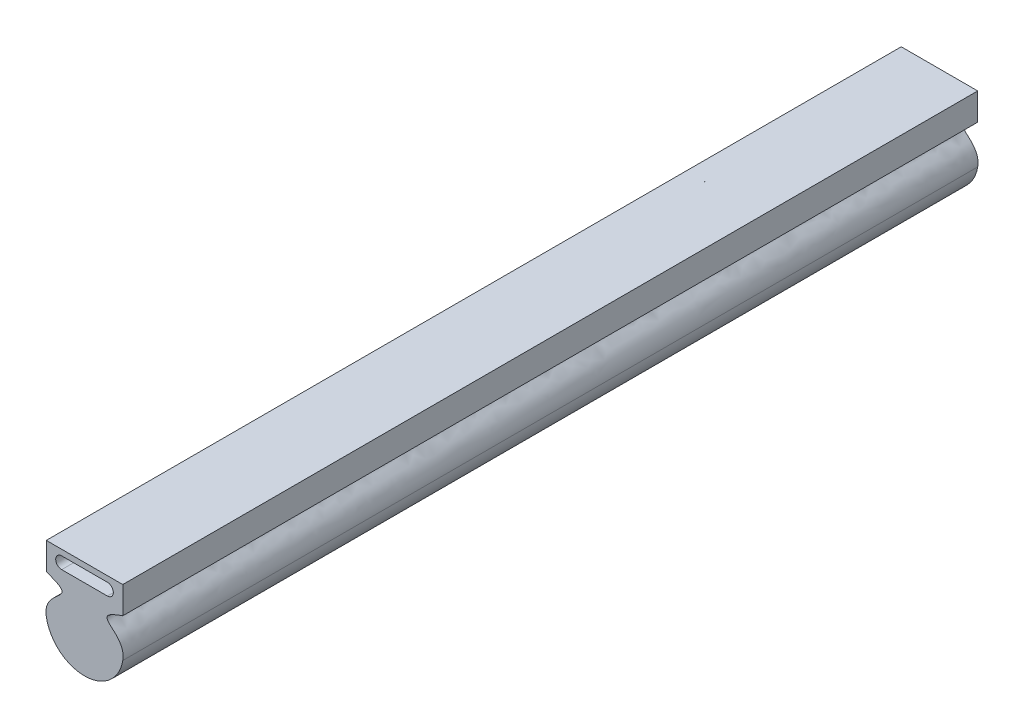
ISO-10303-21;
HEADER;
FILE_DESCRIPTION(('STEP AP214'),'2;1');
FILE_NAME('part.step','',(''),(''),'','','');
FILE_SCHEMA(('AUTOMOTIVE_DESIGN { 1 0 10303 214 1 1 1 1 }'));
ENDSEC;
DATA;
#1=APPLICATION_CONTEXT('core data for automotive mechanical design processes');
#2=APPLICATION_PROTOCOL_DEFINITION('international standard','automotive_design',2000,#1);
#3=PRODUCT_CONTEXT('',#1,'mechanical');
#4=PRODUCT('Part','Part','',(#3));
#5=PRODUCT_RELATED_PRODUCT_CATEGORY('part','',(#4));
#6=PRODUCT_DEFINITION_FORMATION('','',#4);
#7=PRODUCT_DEFINITION_CONTEXT('part definition',#1,'design');
#8=PRODUCT_DEFINITION('design','',#6,#7);
#9=PRODUCT_DEFINITION_SHAPE('','',#8);
#10=(LENGTH_UNIT() NAMED_UNIT(*) SI_UNIT(.MILLI.,.METRE.));
#11=(NAMED_UNIT(*) PLANE_ANGLE_UNIT() SI_UNIT($,.RADIAN.));
#12=(NAMED_UNIT(*) SI_UNIT($,.STERADIAN.) SOLID_ANGLE_UNIT());
#13=UNCERTAINTY_MEASURE_WITH_UNIT(LENGTH_MEASURE(1.E-05),#10,'distance_accuracy_value','');
#14=(GEOMETRIC_REPRESENTATION_CONTEXT(3) GLOBAL_UNCERTAINTY_ASSIGNED_CONTEXT((#13)) GLOBAL_UNIT_ASSIGNED_CONTEXT((#10,
#11,#12)) REPRESENTATION_CONTEXT('',''));
#15=CARTESIAN_POINT('',(0.,0.,0.));
#16=DIRECTION('',(0.,0.,1.));
#17=DIRECTION('',(1.,0.,0.));
#18=AXIS2_PLACEMENT_3D('',#15,#16,#17);
#19=CARTESIAN_POINT('',(9.43579071066527,-15.187762439249,313.));
#20=DIRECTION('',(0.,0.,-1.));
#21=DIRECTION('',(-1.,0.,0.));
#22=AXIS2_PLACEMENT_3D('',#19,#20,#21);
#23=PLANE('',#22);
#24=DIRECTION('',(0.,1.,0.));
#25=VECTOR('',#24,1.);
#26=CARTESIAN_POINT('',(14.,0.,313.));
#27=LINE('',#26,#25);
#28=CARTESIAN_POINT('',(14.,-9.91326315789472,313.));
#29=VERTEX_POINT('',#28);
#30=CARTESIAN_POINT('',(14.,0.,313.));
#31=VERTEX_POINT('',#30);
#32=EDGE_CURVE('E146',#29,#31,#27,.T.);
#33=ORIENTED_EDGE('',*,*,#32,.T.);
#34=DIRECTION('',(-1.,0.,0.));
#35=VECTOR('',#34,1.);
#36=CARTESIAN_POINT('',(-14.,0.,313.));
#37=LINE('',#36,#35);
#38=CARTESIAN_POINT('',(-14.,0.,313.));
#39=VERTEX_POINT('',#38);
#40=EDGE_CURVE('E149',#31,#39,#37,.T.);
#41=ORIENTED_EDGE('',*,*,#40,.T.);
#42=DIRECTION('',(0.,-1.,0.));
#43=VECTOR('',#42,1.);
#44=CARTESIAN_POINT('',(-14.,0.,313.));
#45=LINE('',#44,#43);
#46=CARTESIAN_POINT('',(-14.,-9.91326315789472,313.));
#47=VERTEX_POINT('',#46);
#48=EDGE_CURVE('E152',#39,#47,#45,.T.);
#49=ORIENTED_EDGE('',*,*,#48,.T.);
#50=CARTESIAN_POINT('',(-14.,-9.91326315789472,313.));
#51=CARTESIAN_POINT('',(-0.278502062340376,-14.5534988967406,313.));
#52=CARTESIAN_POINT('',(-15.5502731661003,-14.6090956780988,313.));
#53=CARTESIAN_POINT('',(-14.,-24.1010526315789,313.));
#54=B_SPLINE_CURVE_WITH_KNOTS('',3,(#50,#51,#52,#53),.UNSPECIFIED.,.F.,.F.,(4,4),(0.,1.),.UNSPECIFIED.);
#55=CARTESIAN_POINT('',(-14.,-24.1010526315789,313.));
#56=VERTEX_POINT('',#55);
#57=EDGE_CURVE('E154',#47,#56,#54,.T.);
#58=ORIENTED_EDGE('',*,*,#57,.T.);
#59=CARTESIAN_POINT('',(0.,-21.8145036689388,313.));
#60=DIRECTION('',(0.,0.,1.));
#61=DIRECTION('',(1.,0.,0.));
#62=AXIS2_PLACEMENT_3D('',#59,#60,#61);
#63=CIRCLE('',#62,14.1854963310612);
#64=CARTESIAN_POINT('',(14.,-24.1010526315789,313.));
#65=VERTEX_POINT('',#64);
#66=EDGE_CURVE('E159',#56,#65,#63,.T.);
#67=ORIENTED_EDGE('',*,*,#66,.T.);
#68=CARTESIAN_POINT('',(14.,-24.1010526315789,313.));
#69=CARTESIAN_POINT('',(15.5502731661003,-14.6090956780988,313.));
#70=CARTESIAN_POINT('',(0.278502062340378,-14.5534988967406,313.));
#71=CARTESIAN_POINT('',(14.,-9.91326315789472,313.));
#72=B_SPLINE_CURVE_WITH_KNOTS('',3,(#68,#69,#70,#71),.UNSPECIFIED.,.F.,.F.,(4,4),(0.,1.),.UNSPECIFIED.);
#73=EDGE_CURVE('E196',#65,#29,#72,.T.);
#74=ORIENTED_EDGE('',*,*,#73,.T.);
#75=EDGE_LOOP('',(#33,#41,#49,#58,#67,#74));
#76=FACE_BOUND('',#75,.T.);
#77=CARTESIAN_POINT('',(-8.36715789473685,-4.27716591400382,313.));
#78=DIRECTION('',(0.,0.,1.));
#79=DIRECTION('',(1.,0.,0.));
#80=AXIS2_PLACEMENT_3D('',#77,#78,#79);
#81=CIRCLE('',#80,2.1798939390662);
#82=CARTESIAN_POINT('',(-8.36715789473685,-2.09727197493762,313.));
#83=VERTEX_POINT('',#82);
#84=CARTESIAN_POINT('',(-8.36715789473685,-6.45705985307002,313.));
#85=VERTEX_POINT('',#84);
#86=EDGE_CURVE('E110',#83,#85,#81,.T.);
#87=ORIENTED_EDGE('',*,*,#86,.F.);
#88=DIRECTION('',(-1.,0.,0.));
#89=VECTOR('',#88,1.);
#90=CARTESIAN_POINT('',(-8.36715789473685,-2.09727197493762,313.));
#91=LINE('',#90,#89);
#92=CARTESIAN_POINT('',(8.36715789473685,-2.09727197493762,313.));
#93=VERTEX_POINT('',#92);
#94=EDGE_CURVE('E132',#93,#83,#91,.T.);
#95=ORIENTED_EDGE('',*,*,#94,.F.);
#96=CARTESIAN_POINT('',(8.36715789473685,-4.27716591400382,313.));
#97=DIRECTION('',(0.,0.,1.));
#98=DIRECTION('',(1.,0.,0.));
#99=AXIS2_PLACEMENT_3D('',#96,#97,#98);
#100=CIRCLE('',#99,2.1798939390662);
#101=CARTESIAN_POINT('',(8.36715789473685,-6.45705985307002,313.));
#102=VERTEX_POINT('',#101);
#103=EDGE_CURVE('E130',#102,#93,#100,.T.);
#104=ORIENTED_EDGE('',*,*,#103,.F.);
#105=DIRECTION('',(1.,0.,0.));
#106=VECTOR('',#105,1.);
#107=CARTESIAN_POINT('',(-8.36715789473685,-6.45705985307002,313.));
#108=LINE('',#107,#106);
#109=EDGE_CURVE('E118',#85,#102,#108,.T.);
#110=ORIENTED_EDGE('',*,*,#109,.F.);
#111=EDGE_LOOP('',(#87,#95,#104,#110));
#112=FACE_BOUND('',#111,.T.);
#113=ADVANCED_FACE('F33',(#76,#112),#23,.F.);
#114=CARTESIAN_POINT('',(9.43579071066527,-15.187762439249,0.));
#115=DIRECTION('',(0.,0.,-1.));
#116=DIRECTION('',(-1.,0.,0.));
#117=AXIS2_PLACEMENT_3D('',#114,#115,#116);
#118=PLANE('',#117);
#119=DIRECTION('',(0.,1.,0.));
#120=VECTOR('',#119,1.);
#121=CARTESIAN_POINT('',(14.,0.,0.));
#122=LINE('',#121,#120);
#123=CARTESIAN_POINT('',(14.,-9.91326315789472,0.));
#124=VERTEX_POINT('',#123);
#125=CARTESIAN_POINT('',(14.,0.,0.));
#126=VERTEX_POINT('',#125);
#127=EDGE_CURVE('E126',#124,#126,#122,.T.);
#128=ORIENTED_EDGE('',*,*,#127,.F.);
#129=CARTESIAN_POINT('',(14.,-24.1010526315789,0.));
#130=CARTESIAN_POINT('',(15.5502731661003,-14.6090956780988,0.));
#131=CARTESIAN_POINT('',(0.278502062340378,-14.5534988967406,0.));
#132=CARTESIAN_POINT('',(14.,-9.91326315789472,0.));
#133=B_SPLINE_CURVE_WITH_KNOTS('',3,(#129,#130,#131,#132),.UNSPECIFIED.,.F.,.F.,(4,4),(0.,1.),.UNSPECIFIED.);
#134=CARTESIAN_POINT('',(14.,-24.1010526315789,0.));
#135=VERTEX_POINT('',#134);
#136=EDGE_CURVE('E150',#135,#124,#133,.T.);
#137=ORIENTED_EDGE('',*,*,#136,.F.);
#138=CARTESIAN_POINT('',(0.,-21.8145036689388,0.));
#139=DIRECTION('',(0.,0.,1.));
#140=DIRECTION('',(1.,0.,0.));
#141=AXIS2_PLACEMENT_3D('',#138,#139,#140);
#142=CIRCLE('',#141,14.1854963310612);
#143=CARTESIAN_POINT('',(-14.,-24.1010526315789,0.));
#144=VERTEX_POINT('',#143);
#145=EDGE_CURVE('E215',#144,#135,#142,.T.);
#146=ORIENTED_EDGE('',*,*,#145,.F.);
#147=CARTESIAN_POINT('',(-14.,-9.91326315789472,0.));
#148=CARTESIAN_POINT('',(-0.278502062340376,-14.5534988967406,0.));
#149=CARTESIAN_POINT('',(-15.5502731661003,-14.6090956780988,0.));
#150=CARTESIAN_POINT('',(-14.,-24.1010526315789,0.));
#151=B_SPLINE_CURVE_WITH_KNOTS('',3,(#147,#148,#149,#150),.UNSPECIFIED.,.F.,.F.,(4,4),(0.,1.),.UNSPECIFIED.);
#152=CARTESIAN_POINT('',(-14.,-9.91326315789472,0.));
#153=VERTEX_POINT('',#152);
#154=EDGE_CURVE('E211',#153,#144,#151,.T.);
#155=ORIENTED_EDGE('',*,*,#154,.F.);
#156=DIRECTION('',(0.,-1.,0.));
#157=VECTOR('',#156,1.);
#158=CARTESIAN_POINT('',(-14.,0.,0.));
#159=LINE('',#158,#157);
#160=CARTESIAN_POINT('',(-14.,0.,0.));
#161=VERTEX_POINT('',#160);
#162=EDGE_CURVE('E209',#161,#153,#159,.T.);
#163=ORIENTED_EDGE('',*,*,#162,.F.);
#164=DIRECTION('',(-1.,0.,0.));
#165=VECTOR('',#164,1.);
#166=CARTESIAN_POINT('',(-14.,0.,0.));
#167=LINE('',#166,#165);
#168=EDGE_CURVE('E207',#126,#161,#167,.T.);
#169=ORIENTED_EDGE('',*,*,#168,.F.);
#170=EDGE_LOOP('',(#128,#137,#146,#155,#163,#169));
#171=FACE_BOUND('',#170,.T.);
#172=DIRECTION('',(-1.,0.,0.));
#173=VECTOR('',#172,1.);
#174=CARTESIAN_POINT('',(-8.36715789473685,-2.09727197493762,0.));
#175=LINE('',#174,#173);
#176=CARTESIAN_POINT('',(8.36715789473685,-2.09727197493762,0.));
#177=VERTEX_POINT('',#176);
#178=CARTESIAN_POINT('',(-8.36715789473685,-2.09727197493762,0.));
#179=VERTEX_POINT('',#178);
#180=EDGE_CURVE('E119',#177,#179,#175,.T.);
#181=ORIENTED_EDGE('',*,*,#180,.T.);
#182=CARTESIAN_POINT('',(-8.36715789473685,-4.27716591400382,0.));
#183=DIRECTION('',(0.,0.,1.));
#184=DIRECTION('',(1.,0.,0.));
#185=AXIS2_PLACEMENT_3D('',#182,#183,#184);
#186=CIRCLE('',#185,2.1798939390662);
#187=CARTESIAN_POINT('',(-8.36715789473685,-6.45705985307002,0.));
#188=VERTEX_POINT('',#187);
#189=EDGE_CURVE('E56',#179,#188,#186,.T.);
#190=ORIENTED_EDGE('',*,*,#189,.T.);
#191=DIRECTION('',(1.,0.,0.));
#192=VECTOR('',#191,1.);
#193=CARTESIAN_POINT('',(-8.36715789473685,-6.45705985307002,0.));
#194=LINE('',#193,#192);
#195=CARTESIAN_POINT('',(8.36715789473685,-6.45705985307002,0.));
#196=VERTEX_POINT('',#195);
#197=EDGE_CURVE('E125',#188,#196,#194,.T.);
#198=ORIENTED_EDGE('',*,*,#197,.T.);
#199=CARTESIAN_POINT('',(8.36715789473685,-4.27716591400382,0.));
#200=DIRECTION('',(0.,0.,1.));
#201=DIRECTION('',(1.,0.,0.));
#202=AXIS2_PLACEMENT_3D('',#199,#200,#201);
#203=CIRCLE('',#202,2.1798939390662);
#204=EDGE_CURVE('E138',#196,#177,#203,.T.);
#205=ORIENTED_EDGE('',*,*,#204,.T.);
#206=EDGE_LOOP('',(#181,#190,#198,#205));
#207=FACE_BOUND('',#206,.T.);
#208=ADVANCED_FACE('F181',(#171,#207),#118,.T.);
#209=CARTESIAN_POINT('',(14.,0.,313.));
#210=DIRECTION('',(-1.,0.,0.));
#211=DIRECTION('',(0.,-1.,0.));
#212=AXIS2_PLACEMENT_3D('',#209,#210,#211);
#213=PLANE('',#212);
#214=ORIENTED_EDGE('',*,*,#127,.T.);
#215=DIRECTION('',(0.,0.,-1.));
#216=VECTOR('',#215,1.);
#217=CARTESIAN_POINT('',(14.,0.,313.));
#218=LINE('',#217,#216);
#219=EDGE_CURVE('E11',#31,#126,#218,.T.);
#220=ORIENTED_EDGE('',*,*,#219,.F.);
#221=ORIENTED_EDGE('',*,*,#32,.F.);
#222=DIRECTION('',(0.,0.,-1.));
#223=VECTOR('',#222,1.);
#224=CARTESIAN_POINT('',(14.,-9.91326315789472,313.));
#225=LINE('',#224,#223);
#226=EDGE_CURVE('E201',#29,#124,#225,.T.);
#227=ORIENTED_EDGE('',*,*,#226,.T.);
#228=EDGE_LOOP('',(#214,#220,#221,#227));
#229=FACE_BOUND('',#228,.T.);
#230=ADVANCED_FACE('F35',(#229),#213,.F.);
#231=CARTESIAN_POINT('',(-14.,0.,313.));
#232=DIRECTION('',(0.,-1.,0.));
#233=DIRECTION('',(0.,0.,-1.));
#234=AXIS2_PLACEMENT_3D('',#231,#232,#233);
#235=PLANE('',#234);
#236=ORIENTED_EDGE('',*,*,#168,.T.);
#237=DIRECTION('',(0.,0.,-1.));
#238=VECTOR('',#237,1.);
#239=CARTESIAN_POINT('',(-14.,0.,313.));
#240=LINE('',#239,#238);
#241=EDGE_CURVE('E41',#39,#161,#240,.T.);
#242=ORIENTED_EDGE('',*,*,#241,.F.);
#243=ORIENTED_EDGE('',*,*,#40,.F.);
#244=ORIENTED_EDGE('',*,*,#219,.T.);
#245=EDGE_LOOP('',(#236,#242,#243,#244));
#246=FACE_BOUND('',#245,.T.);
#247=ADVANCED_FACE('F174',(#246),#235,.F.);
#248=CARTESIAN_POINT('',(-14.,0.,313.));
#249=DIRECTION('',(1.,0.,0.));
#250=DIRECTION('',(0.,1.,0.));
#251=AXIS2_PLACEMENT_3D('',#248,#249,#250);
#252=PLANE('',#251);
#253=ORIENTED_EDGE('',*,*,#162,.T.);
#254=DIRECTION('',(0.,0.,-1.));
#255=VECTOR('',#254,1.);
#256=CARTESIAN_POINT('',(-14.,-9.91326315789472,313.));
#257=LINE('',#256,#255);
#258=EDGE_CURVE('E234',#47,#153,#257,.T.);
#259=ORIENTED_EDGE('',*,*,#258,.F.);
#260=ORIENTED_EDGE('',*,*,#48,.F.);
#261=ORIENTED_EDGE('',*,*,#241,.T.);
#262=EDGE_LOOP('',(#253,#259,#260,#261));
#263=FACE_BOUND('',#262,.T.);
#264=ADVANCED_FACE('F170',(#263),#252,.F.);
#265=DIRECTION('',(0.,0.,-1.));
#266=VECTOR('',#265,1.);
#267=SURFACE_OF_LINEAR_EXTRUSION('',#54,#266);
#268=ORIENTED_EDGE('',*,*,#154,.T.);
#269=DIRECTION('',(0.,0.,-1.));
#270=VECTOR('',#269,1.);
#271=CARTESIAN_POINT('',(-14.,-24.1010526315789,313.));
#272=LINE('',#271,#270);
#273=EDGE_CURVE('E231',#56,#144,#272,.T.);
#274=ORIENTED_EDGE('',*,*,#273,.F.);
#275=ORIENTED_EDGE('',*,*,#57,.F.);
#276=ORIENTED_EDGE('',*,*,#258,.T.);
#277=EDGE_LOOP('',(#268,#274,#275,#276));
#278=FACE_BOUND('',#277,.T.);
#279=ADVANCED_FACE('F165',(#278),#267,.F.);
#280=CARTESIAN_POINT('',(0.,-21.8145036689388,313.));
#281=DIRECTION('',(0.,0.,-1.));
#282=DIRECTION('',(-1.,0.,0.));
#283=AXIS2_PLACEMENT_3D('',#280,#281,#282);
#284=CYLINDRICAL_SURFACE('',#283,14.1854963310612);
#285=ORIENTED_EDGE('',*,*,#145,.T.);
#286=DIRECTION('',(0.,0.,-1.));
#287=VECTOR('',#286,1.);
#288=CARTESIAN_POINT('',(14.,-24.1010526315789,313.));
#289=LINE('',#288,#287);
#290=EDGE_CURVE('E228',#65,#135,#289,.T.);
#291=ORIENTED_EDGE('',*,*,#290,.F.);
#292=ORIENTED_EDGE('',*,*,#66,.F.);
#293=ORIENTED_EDGE('',*,*,#273,.T.);
#294=EDGE_LOOP('',(#285,#291,#292,#293));
#295=FACE_BOUND('',#294,.T.);
#296=ADVANCED_FACE('F169',(#295),#284,.T.);
#297=DIRECTION('',(0.,0.,-1.));
#298=VECTOR('',#297,1.);
#299=SURFACE_OF_LINEAR_EXTRUSION('',#72,#298);
#300=ORIENTED_EDGE('',*,*,#136,.T.);
#301=ORIENTED_EDGE('',*,*,#226,.F.);
#302=ORIENTED_EDGE('',*,*,#73,.F.);
#303=ORIENTED_EDGE('',*,*,#290,.T.);
#304=EDGE_LOOP('',(#300,#301,#302,#303));
#305=FACE_BOUND('',#304,.T.);
#306=ADVANCED_FACE('F193',(#305),#299,.F.);
#307=CARTESIAN_POINT('',(-8.36715789473685,-4.27716591400382,313.));
#308=DIRECTION('',(0.,0.,-1.));
#309=DIRECTION('',(-1.,0.,0.));
#310=AXIS2_PLACEMENT_3D('',#307,#308,#309);
#311=CYLINDRICAL_SURFACE('',#310,2.1798939390662);
#312=ORIENTED_EDGE('',*,*,#189,.F.);
#313=DIRECTION('',(0.,0.,-1.));
#314=VECTOR('',#313,1.);
#315=CARTESIAN_POINT('',(-8.36715789473685,-2.09727197493762,313.));
#316=LINE('',#315,#314);
#317=EDGE_CURVE('E114',#83,#179,#316,.T.);
#318=ORIENTED_EDGE('',*,*,#317,.F.);
#319=ORIENTED_EDGE('',*,*,#86,.T.);
#320=DIRECTION('',(0.,0.,-1.));
#321=VECTOR('',#320,1.);
#322=CARTESIAN_POINT('',(-8.36715789473685,-6.45705985307002,313.));
#323=LINE('',#322,#321);
#324=EDGE_CURVE('E113',#85,#188,#323,.T.);
#325=ORIENTED_EDGE('',*,*,#324,.T.);
#326=EDGE_LOOP('',(#312,#318,#319,#325));
#327=FACE_BOUND('',#326,.T.);
#328=ADVANCED_FACE('F112',(#327),#311,.F.);
#329=CARTESIAN_POINT('',(-8.36715789473685,-6.45705985307002,313.));
#330=DIRECTION('',(0.,1.,0.));
#331=DIRECTION('',(0.,0.,1.));
#332=AXIS2_PLACEMENT_3D('',#329,#330,#331);
#333=PLANE('',#332);
#334=ORIENTED_EDGE('',*,*,#197,.F.);
#335=ORIENTED_EDGE('',*,*,#324,.F.);
#336=ORIENTED_EDGE('',*,*,#109,.T.);
#337=DIRECTION('',(0.,0.,-1.));
#338=VECTOR('',#337,1.);
#339=CARTESIAN_POINT('',(8.36715789473685,-6.45705985307002,313.));
#340=LINE('',#339,#338);
#341=EDGE_CURVE('E127',#102,#196,#340,.T.);
#342=ORIENTED_EDGE('',*,*,#341,.T.);
#343=EDGE_LOOP('',(#334,#335,#336,#342));
#344=FACE_BOUND('',#343,.T.);
#345=ADVANCED_FACE('F122',(#344),#333,.T.);
#346=CARTESIAN_POINT('',(8.36715789473685,-4.27716591400382,313.));
#347=DIRECTION('',(0.,0.,-1.));
#348=DIRECTION('',(-1.,0.,0.));
#349=AXIS2_PLACEMENT_3D('',#346,#347,#348);
#350=CYLINDRICAL_SURFACE('',#349,2.1798939390662);
#351=ORIENTED_EDGE('',*,*,#204,.F.);
#352=ORIENTED_EDGE('',*,*,#341,.F.);
#353=ORIENTED_EDGE('',*,*,#103,.T.);
#354=DIRECTION('',(0.,0.,-1.));
#355=VECTOR('',#354,1.);
#356=CARTESIAN_POINT('',(8.36715789473685,-2.09727197493762,313.));
#357=LINE('',#356,#355);
#358=EDGE_CURVE('E48',#93,#177,#357,.T.);
#359=ORIENTED_EDGE('',*,*,#358,.T.);
#360=EDGE_LOOP('',(#351,#352,#353,#359));
#361=FACE_BOUND('',#360,.T.);
#362=ADVANCED_FACE('F275',(#361),#350,.F.);
#363=CARTESIAN_POINT('',(-8.36715789473685,-2.09727197493762,313.));
#364=DIRECTION('',(0.,-1.,0.));
#365=DIRECTION('',(0.,0.,-1.));
#366=AXIS2_PLACEMENT_3D('',#363,#364,#365);
#367=PLANE('',#366);
#368=ORIENTED_EDGE('',*,*,#180,.F.);
#369=ORIENTED_EDGE('',*,*,#358,.F.);
#370=ORIENTED_EDGE('',*,*,#94,.T.);
#371=ORIENTED_EDGE('',*,*,#317,.T.);
#372=EDGE_LOOP('',(#368,#369,#370,#371));
#373=FACE_BOUND('',#372,.T.);
#374=ADVANCED_FACE('F281',(#373),#367,.T.);
#375=CLOSED_SHELL('',(#113,#208,#230,#247,#264,#279,#296,#306,#328,#345,#362,#374));
#376=MANIFOLD_SOLID_BREP('B2',#375);
#377=ADVANCED_BREP_SHAPE_REPRESENTATION('',(#18,#376),#14);
#378=SHAPE_DEFINITION_REPRESENTATION(#9,#377);
ENDSEC;
END-ISO-10303-21;
